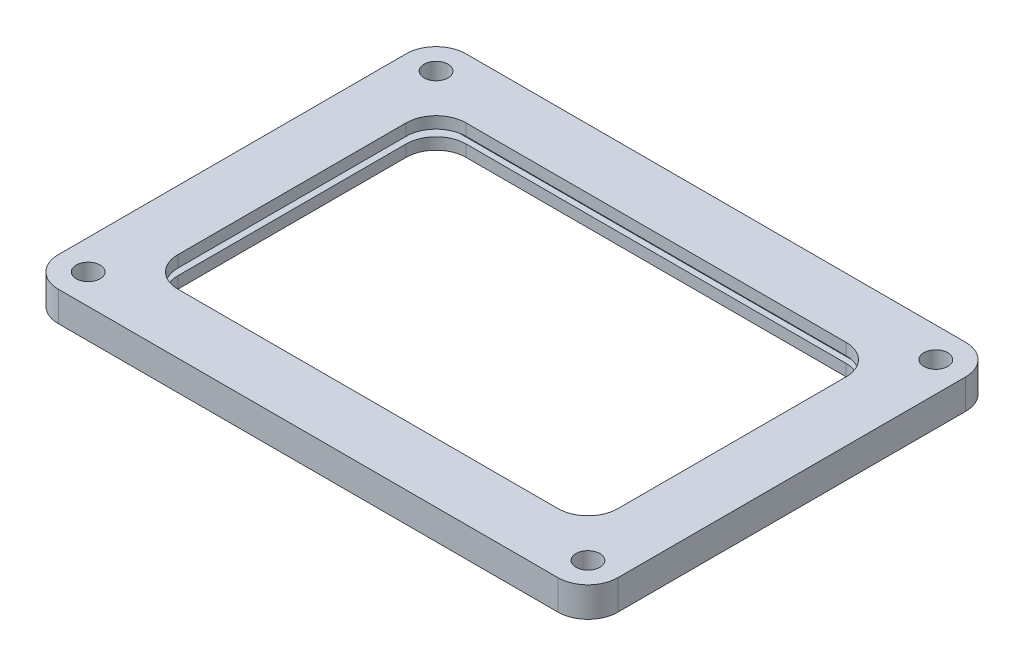
ISO-10303-21;
HEADER;
FILE_DESCRIPTION(('STEP AP214'),'2;1');
FILE_NAME('part.step','',(''),(''),'','','');
FILE_SCHEMA(('AUTOMOTIVE_DESIGN { 1 0 10303 214 1 1 1 1 }'));
ENDSEC;
DATA;
#1=APPLICATION_CONTEXT('core data for automotive mechanical design processes');
#2=APPLICATION_PROTOCOL_DEFINITION('international standard','automotive_design',2000,#1);
#3=PRODUCT_CONTEXT('',#1,'mechanical');
#4=PRODUCT('Part','Part','',(#3));
#5=PRODUCT_RELATED_PRODUCT_CATEGORY('part','',(#4));
#6=PRODUCT_DEFINITION_FORMATION('','',#4);
#7=PRODUCT_DEFINITION_CONTEXT('part definition',#1,'design');
#8=PRODUCT_DEFINITION('design','',#6,#7);
#9=PRODUCT_DEFINITION_SHAPE('','',#8);
#10=(LENGTH_UNIT() NAMED_UNIT(*) SI_UNIT(.MILLI.,.METRE.));
#11=(NAMED_UNIT(*) PLANE_ANGLE_UNIT() SI_UNIT($,.RADIAN.));
#12=(NAMED_UNIT(*) SI_UNIT($,.STERADIAN.) SOLID_ANGLE_UNIT());
#13=UNCERTAINTY_MEASURE_WITH_UNIT(LENGTH_MEASURE(1.E-05),#10,'distance_accuracy_value','');
#14=(GEOMETRIC_REPRESENTATION_CONTEXT(3) GLOBAL_UNCERTAINTY_ASSIGNED_CONTEXT((#13)) GLOBAL_UNIT_ASSIGNED_CONTEXT((#10,
#11,#12)) REPRESENTATION_CONTEXT('',''));
#15=CARTESIAN_POINT('',(0.,0.,0.));
#16=DIRECTION('',(0.,0.,1.));
#17=DIRECTION('',(1.,0.,0.));
#18=AXIS2_PLACEMENT_3D('',#15,#16,#17);
#19=CARTESIAN_POINT('',(-36.79,5.,0.));
#20=DIRECTION('',(-1.,0.,0.));
#21=DIRECTION('',(0.,0.,1.));
#22=AXIS2_PLACEMENT_3D('',#19,#20,#21);
#23=PLANE('',#22);
#24=DIRECTION('',(0.,-1.,0.));
#25=VECTOR('',#24,1.);
#26=CARTESIAN_POINT('',(-36.79,5.,19.09));
#27=LINE('',#26,#25);
#28=CARTESIAN_POINT('',(-36.79,5.,19.09));
#29=VERTEX_POINT('',#28);
#30=CARTESIAN_POINT('',(-36.79,3.05,19.09));
#31=VERTEX_POINT('',#30);
#32=EDGE_CURVE('E428',#29,#31,#27,.T.);
#33=ORIENTED_EDGE('',*,*,#32,.T.);
#34=DIRECTION('',(0.,0.,-1.));
#35=VECTOR('',#34,1.);
#36=CARTESIAN_POINT('',(-36.79,3.05,0.));
#37=LINE('',#36,#35);
#38=CARTESIAN_POINT('',(-36.79,3.05,-19.09));
#39=VERTEX_POINT('',#38);
#40=EDGE_CURVE('E275',#31,#39,#37,.T.);
#41=ORIENTED_EDGE('',*,*,#40,.T.);
#42=DIRECTION('',(0.,-1.,0.));
#43=VECTOR('',#42,1.);
#44=CARTESIAN_POINT('',(-36.79,5.,-19.09));
#45=LINE('',#44,#43);
#46=CARTESIAN_POINT('',(-36.79,5.,-19.09));
#47=VERTEX_POINT('',#46);
#48=EDGE_CURVE('E423',#39,#47,#45,.F.);
#49=ORIENTED_EDGE('',*,*,#48,.T.);
#50=DIRECTION('',(0.,0.,-1.));
#51=VECTOR('',#50,1.);
#52=CARTESIAN_POINT('',(-36.79,5.,0.));
#53=LINE('',#52,#51);
#54=EDGE_CURVE('E316',#29,#47,#53,.T.);
#55=ORIENTED_EDGE('',*,*,#54,.F.);
#56=EDGE_LOOP('',(#33,#41,#49,#55));
#57=FACE_BOUND('',#56,.T.);
#58=ADVANCED_FACE('F35',(#57),#23,.F.);
#59=CARTESIAN_POINT('',(0.,5.,24.09));
#60=DIRECTION('',(0.,0.,-1.));
#61=DIRECTION('',(-1.,0.,0.));
#62=AXIS2_PLACEMENT_3D('',#59,#60,#61);
#63=PLANE('',#62);
#64=DIRECTION('',(1.,0.,0.));
#65=VECTOR('',#64,1.);
#66=CARTESIAN_POINT('',(0.,3.05,24.09));
#67=LINE('',#66,#65);
#68=CARTESIAN_POINT('',(-31.79,3.05,24.09));
#69=VERTEX_POINT('',#68);
#70=CARTESIAN_POINT('',(31.79,3.05,24.09));
#71=VERTEX_POINT('',#70);
#72=EDGE_CURVE('E286',#69,#71,#67,.T.);
#73=ORIENTED_EDGE('',*,*,#72,.F.);
#74=DIRECTION('',(0.,-1.,0.));
#75=VECTOR('',#74,1.);
#76=CARTESIAN_POINT('',(-31.79,5.,24.09));
#77=LINE('',#76,#75);
#78=CARTESIAN_POINT('',(-31.79,5.,24.09));
#79=VERTEX_POINT('',#78);
#80=EDGE_CURVE('E399',#69,#79,#77,.F.);
#81=ORIENTED_EDGE('',*,*,#80,.T.);
#82=DIRECTION('',(1.,0.,0.));
#83=VECTOR('',#82,1.);
#84=CARTESIAN_POINT('',(0.,5.,24.09));
#85=LINE('',#84,#83);
#86=CARTESIAN_POINT('',(31.79,5.,24.09));
#87=VERTEX_POINT('',#86);
#88=EDGE_CURVE('E319',#79,#87,#85,.T.);
#89=ORIENTED_EDGE('',*,*,#88,.T.);
#90=DIRECTION('',(0.,-1.,0.));
#91=VECTOR('',#90,1.);
#92=CARTESIAN_POINT('',(31.79,0.,24.09));
#93=LINE('',#92,#91);
#94=EDGE_CURVE('E404',#87,#71,#93,.T.);
#95=ORIENTED_EDGE('',*,*,#94,.T.);
#96=EDGE_LOOP('',(#73,#81,#89,#95));
#97=FACE_BOUND('',#96,.T.);
#98=ADVANCED_FACE('F496',(#97),#63,.T.);
#99=CARTESIAN_POINT('',(36.79,5.,0.));
#100=DIRECTION('',(-1.,0.,0.));
#101=DIRECTION('',(0.,0.,1.));
#102=AXIS2_PLACEMENT_3D('',#99,#100,#101);
#103=PLANE('',#102);
#104=DIRECTION('',(0.,0.,-1.));
#105=VECTOR('',#104,1.);
#106=CARTESIAN_POINT('',(36.79,3.05,0.));
#107=LINE('',#106,#105);
#108=CARTESIAN_POINT('',(36.79,3.05,19.09));
#109=VERTEX_POINT('',#108);
#110=CARTESIAN_POINT('',(36.79,3.05,-19.09));
#111=VERTEX_POINT('',#110);
#112=EDGE_CURVE('E284',#109,#111,#107,.T.);
#113=ORIENTED_EDGE('',*,*,#112,.F.);
#114=DIRECTION('',(0.,-1.,0.));
#115=VECTOR('',#114,1.);
#116=CARTESIAN_POINT('',(36.79,5.,19.09));
#117=LINE('',#116,#115);
#118=CARTESIAN_POINT('',(36.79,5.,19.09));
#119=VERTEX_POINT('',#118);
#120=EDGE_CURVE('E411',#109,#119,#117,.F.);
#121=ORIENTED_EDGE('',*,*,#120,.T.);
#122=DIRECTION('',(0.,0.,-1.));
#123=VECTOR('',#122,1.);
#124=CARTESIAN_POINT('',(36.79,5.,0.));
#125=LINE('',#124,#123);
#126=CARTESIAN_POINT('',(36.79,5.,-19.09));
#127=VERTEX_POINT('',#126);
#128=EDGE_CURVE('E323',#119,#127,#125,.T.);
#129=ORIENTED_EDGE('',*,*,#128,.T.);
#130=DIRECTION('',(0.,-1.,0.));
#131=VECTOR('',#130,1.);
#132=CARTESIAN_POINT('',(36.79,5.,-19.09));
#133=LINE('',#132,#131);
#134=EDGE_CURVE('E408',#127,#111,#133,.T.);
#135=ORIENTED_EDGE('',*,*,#134,.T.);
#136=EDGE_LOOP('',(#113,#121,#129,#135));
#137=FACE_BOUND('',#136,.T.);
#138=ADVANCED_FACE('F502',(#137),#103,.T.);
#139=CARTESIAN_POINT('',(0.,5.,-24.09));
#140=DIRECTION('',(0.,0.,-1.));
#141=DIRECTION('',(-1.,0.,0.));
#142=AXIS2_PLACEMENT_3D('',#139,#140,#141);
#143=PLANE('',#142);
#144=DIRECTION('',(0.,-1.,0.));
#145=VECTOR('',#144,1.);
#146=CARTESIAN_POINT('',(-31.79,0.,-24.09));
#147=LINE('',#146,#145);
#148=CARTESIAN_POINT('',(-31.79,5.,-24.09));
#149=VERTEX_POINT('',#148);
#150=CARTESIAN_POINT('',(-31.79,3.05,-24.09));
#151=VERTEX_POINT('',#150);
#152=EDGE_CURVE('E416',#149,#151,#147,.T.);
#153=ORIENTED_EDGE('',*,*,#152,.T.);
#154=DIRECTION('',(1.,0.,0.));
#155=VECTOR('',#154,1.);
#156=CARTESIAN_POINT('',(0.,3.05,-24.09));
#157=LINE('',#156,#155);
#158=CARTESIAN_POINT('',(31.79,3.05,-24.09));
#159=VERTEX_POINT('',#158);
#160=EDGE_CURVE('E58',#151,#159,#157,.T.);
#161=ORIENTED_EDGE('',*,*,#160,.T.);
#162=DIRECTION('',(0.,-1.,0.));
#163=VECTOR('',#162,1.);
#164=CARTESIAN_POINT('',(31.79,5.,-24.09));
#165=LINE('',#164,#163);
#166=CARTESIAN_POINT('',(31.79,5.,-24.09));
#167=VERTEX_POINT('',#166);
#168=EDGE_CURVE('E419',#159,#167,#165,.F.);
#169=ORIENTED_EDGE('',*,*,#168,.T.);
#170=DIRECTION('',(1.,0.,0.));
#171=VECTOR('',#170,1.);
#172=CARTESIAN_POINT('',(0.,5.,-24.09));
#173=LINE('',#172,#171);
#174=EDGE_CURVE('E326',#149,#167,#173,.T.);
#175=ORIENTED_EDGE('',*,*,#174,.F.);
#176=EDGE_LOOP('',(#153,#161,#169,#175));
#177=FACE_BOUND('',#176,.T.);
#178=ADVANCED_FACE('F549',(#177),#143,.F.);
#179=CARTESIAN_POINT('',(31.79,5.,19.09));
#180=DIRECTION('',(0.,1.,0.));
#181=DIRECTION('',(0.,0.,1.));
#182=AXIS2_PLACEMENT_3D('',#179,#180,#181);
#183=CYLINDRICAL_SURFACE('',#182,5.);
#184=ORIENTED_EDGE('',*,*,#120,.F.);
#185=CARTESIAN_POINT('',(31.79,3.05,19.09));
#186=DIRECTION('',(0.,1.,0.));
#187=DIRECTION('',(0.,0.,1.));
#188=AXIS2_PLACEMENT_3D('',#185,#186,#187);
#189=CIRCLE('',#188,5.);
#190=EDGE_CURVE('E288',#109,#71,#189,.F.);
#191=ORIENTED_EDGE('',*,*,#190,.T.);
#192=ORIENTED_EDGE('',*,*,#94,.F.);
#193=CARTESIAN_POINT('',(31.79,5.,19.09));
#194=DIRECTION('',(0.,1.,0.));
#195=DIRECTION('',(0.,0.,1.));
#196=AXIS2_PLACEMENT_3D('',#193,#194,#195);
#197=CIRCLE('',#196,5.);
#198=EDGE_CURVE('E433',#119,#87,#197,.F.);
#199=ORIENTED_EDGE('',*,*,#198,.F.);
#200=EDGE_LOOP('',(#184,#191,#192,#199));
#201=FACE_BOUND('',#200,.T.);
#202=ADVANCED_FACE('F545',(#201),#183,.F.);
#203=CARTESIAN_POINT('',(31.79,5.,-19.09));
#204=DIRECTION('',(0.,-1.,0.));
#205=DIRECTION('',(0.,0.,-1.));
#206=AXIS2_PLACEMENT_3D('',#203,#204,#205);
#207=CYLINDRICAL_SURFACE('',#206,5.);
#208=ORIENTED_EDGE('',*,*,#168,.F.);
#209=CARTESIAN_POINT('',(31.79,3.05,-19.09));
#210=DIRECTION('',(0.,1.,0.));
#211=DIRECTION('',(0.,0.,1.));
#212=AXIS2_PLACEMENT_3D('',#209,#210,#211);
#213=CIRCLE('',#212,5.);
#214=EDGE_CURVE('E281',#159,#111,#213,.F.);
#215=ORIENTED_EDGE('',*,*,#214,.T.);
#216=ORIENTED_EDGE('',*,*,#134,.F.);
#217=CARTESIAN_POINT('',(31.79,5.,-19.09));
#218=DIRECTION('',(0.,1.,0.));
#219=DIRECTION('',(0.,0.,1.));
#220=AXIS2_PLACEMENT_3D('',#217,#218,#219);
#221=CIRCLE('',#220,5.);
#222=EDGE_CURVE('E437',#167,#127,#221,.F.);
#223=ORIENTED_EDGE('',*,*,#222,.F.);
#224=EDGE_LOOP('',(#208,#215,#216,#223));
#225=FACE_BOUND('',#224,.T.);
#226=ADVANCED_FACE('F492',(#225),#207,.F.);
#227=CARTESIAN_POINT('',(-31.79,5.,19.09));
#228=DIRECTION('',(0.,-1.,0.));
#229=DIRECTION('',(0.,0.,-1.));
#230=AXIS2_PLACEMENT_3D('',#227,#228,#229);
#231=CYLINDRICAL_SURFACE('',#230,5.);
#232=ORIENTED_EDGE('',*,*,#80,.F.);
#233=CARTESIAN_POINT('',(-31.79,3.05,19.09));
#234=DIRECTION('',(0.,1.,0.));
#235=DIRECTION('',(0.,0.,1.));
#236=AXIS2_PLACEMENT_3D('',#233,#234,#235);
#237=CIRCLE('',#236,5.);
#238=EDGE_CURVE('E278',#69,#31,#237,.F.);
#239=ORIENTED_EDGE('',*,*,#238,.T.);
#240=ORIENTED_EDGE('',*,*,#32,.F.);
#241=CARTESIAN_POINT('',(-31.79,5.,19.09));
#242=DIRECTION('',(0.,1.,0.));
#243=DIRECTION('',(0.,0.,1.));
#244=AXIS2_PLACEMENT_3D('',#241,#242,#243);
#245=CIRCLE('',#244,5.);
#246=EDGE_CURVE('E441',#79,#29,#245,.F.);
#247=ORIENTED_EDGE('',*,*,#246,.F.);
#248=EDGE_LOOP('',(#232,#239,#240,#247));
#249=FACE_BOUND('',#248,.T.);
#250=ADVANCED_FACE('F484',(#249),#231,.F.);
#251=CARTESIAN_POINT('',(-31.79,5.,-19.09));
#252=DIRECTION('',(0.,1.,0.));
#253=DIRECTION('',(0.,0.,1.));
#254=AXIS2_PLACEMENT_3D('',#251,#252,#253);
#255=CYLINDRICAL_SURFACE('',#254,5.);
#256=ORIENTED_EDGE('',*,*,#48,.F.);
#257=CARTESIAN_POINT('',(-31.79,3.05,-19.09));
#258=DIRECTION('',(0.,1.,0.));
#259=DIRECTION('',(0.,0.,1.));
#260=AXIS2_PLACEMENT_3D('',#257,#258,#259);
#261=CIRCLE('',#260,5.);
#262=EDGE_CURVE('E12',#39,#151,#261,.F.);
#263=ORIENTED_EDGE('',*,*,#262,.T.);
#264=ORIENTED_EDGE('',*,*,#152,.F.);
#265=CARTESIAN_POINT('',(-31.79,5.,-19.09));
#266=DIRECTION('',(0.,1.,0.));
#267=DIRECTION('',(0.,0.,1.));
#268=AXIS2_PLACEMENT_3D('',#265,#266,#267);
#269=CIRCLE('',#268,5.);
#270=EDGE_CURVE('E445',#47,#149,#269,.F.);
#271=ORIENTED_EDGE('',*,*,#270,.F.);
#272=EDGE_LOOP('',(#256,#263,#264,#271));
#273=FACE_BOUND('',#272,.T.);
#274=ADVANCED_FACE('F490',(#273),#255,.F.);
#275=CARTESIAN_POINT('',(0.,5.,0.));
#276=DIRECTION('',(0.,1.,0.));
#277=DIRECTION('',(0.,0.,1.));
#278=AXIS2_PLACEMENT_3D('',#275,#276,#277);
#279=PLANE('',#278);
#280=CARTESIAN_POINT('',(41.79,5.,29.09));
#281=DIRECTION('',(0.,1.,0.));
#282=DIRECTION('',(0.,0.,1.));
#283=AXIS2_PLACEMENT_3D('',#280,#281,#282);
#284=CIRCLE('',#283,2.);
#285=CARTESIAN_POINT('',(41.79,5.,31.09));
#286=VERTEX_POINT('',#285);
#287=EDGE_CURVE('E296',#286,#286,#284,.T.);
#288=ORIENTED_EDGE('',*,*,#287,.F.);
#289=EDGE_LOOP('',(#288));
#290=FACE_BOUND('',#289,.T.);
#291=CARTESIAN_POINT('',(41.79,5.,-29.09));
#292=DIRECTION('',(0.,-1.,0.));
#293=DIRECTION('',(0.,0.,-1.));
#294=AXIS2_PLACEMENT_3D('',#291,#292,#293);
#295=CIRCLE('',#294,2.);
#296=CARTESIAN_POINT('',(41.79,5.,-31.09));
#297=VERTEX_POINT('',#296);
#298=EDGE_CURVE('E310',#297,#297,#295,.T.);
#299=ORIENTED_EDGE('',*,*,#298,.T.);
#300=EDGE_LOOP('',(#299));
#301=FACE_BOUND('',#300,.T.);
#302=ORIENTED_EDGE('',*,*,#88,.F.);
#303=ORIENTED_EDGE('',*,*,#246,.T.);
#304=ORIENTED_EDGE('',*,*,#54,.T.);
#305=ORIENTED_EDGE('',*,*,#270,.T.);
#306=ORIENTED_EDGE('',*,*,#174,.T.);
#307=ORIENTED_EDGE('',*,*,#222,.T.);
#308=ORIENTED_EDGE('',*,*,#128,.F.);
#309=ORIENTED_EDGE('',*,*,#198,.T.);
#310=EDGE_LOOP('',(#302,#303,#304,#305,#306,#307,#308,#309));
#311=FACE_BOUND('',#310,.T.);
#312=DIRECTION('',(1.,0.,0.));
#313=VECTOR('',#312,1.);
#314=CARTESIAN_POINT('',(-46.79,5.,-34.09));
#315=LINE('',#314,#313);
#316=CARTESIAN_POINT('',(-41.79,5.,-34.09));
#317=VERTEX_POINT('',#316);
#318=CARTESIAN_POINT('',(41.79,5.,-34.09));
#319=VERTEX_POINT('',#318);
#320=EDGE_CURVE('E347',#317,#319,#315,.T.);
#321=ORIENTED_EDGE('',*,*,#320,.F.);
#322=CARTESIAN_POINT('',(-41.79,5.,-29.09));
#323=DIRECTION('',(0.,1.,0.));
#324=DIRECTION('',(0.,0.,1.));
#325=AXIS2_PLACEMENT_3D('',#322,#323,#324);
#326=CIRCLE('',#325,5.);
#327=CARTESIAN_POINT('',(-46.79,5.,-29.09));
#328=VERTEX_POINT('',#327);
#329=EDGE_CURVE('E387',#317,#328,#326,.T.);
#330=ORIENTED_EDGE('',*,*,#329,.T.);
#331=DIRECTION('',(0.,0.,-1.));
#332=VECTOR('',#331,1.);
#333=CARTESIAN_POINT('',(-46.79,5.,34.09));
#334=LINE('',#333,#332);
#335=CARTESIAN_POINT('',(-46.79,5.,29.09));
#336=VERTEX_POINT('',#335);
#337=EDGE_CURVE('E350',#336,#328,#334,.T.);
#338=ORIENTED_EDGE('',*,*,#337,.F.);
#339=CARTESIAN_POINT('',(-41.79,5.,29.09));
#340=DIRECTION('',(0.,1.,0.));
#341=DIRECTION('',(0.,0.,1.));
#342=AXIS2_PLACEMENT_3D('',#339,#340,#341);
#343=CIRCLE('',#342,5.);
#344=CARTESIAN_POINT('',(-41.79,5.,34.09));
#345=VERTEX_POINT('',#344);
#346=EDGE_CURVE('E385',#336,#345,#343,.T.);
#347=ORIENTED_EDGE('',*,*,#346,.T.);
#348=DIRECTION('',(1.,0.,0.));
#349=VECTOR('',#348,1.);
#350=CARTESIAN_POINT('',(-46.79,5.,34.09));
#351=LINE('',#350,#349);
#352=CARTESIAN_POINT('',(41.79,5.,34.09));
#353=VERTEX_POINT('',#352);
#354=EDGE_CURVE('E340',#345,#353,#351,.T.);
#355=ORIENTED_EDGE('',*,*,#354,.T.);
#356=CARTESIAN_POINT('',(41.79,5.,29.09));
#357=DIRECTION('',(0.,1.,0.));
#358=DIRECTION('',(0.,0.,1.));
#359=AXIS2_PLACEMENT_3D('',#356,#357,#358);
#360=CIRCLE('',#359,5.);
#361=CARTESIAN_POINT('',(46.79,5.,29.09));
#362=VERTEX_POINT('',#361);
#363=EDGE_CURVE('E381',#353,#362,#360,.T.);
#364=ORIENTED_EDGE('',*,*,#363,.T.);
#365=DIRECTION('',(0.,0.,-1.));
#366=VECTOR('',#365,1.);
#367=CARTESIAN_POINT('',(46.79,5.,34.09));
#368=LINE('',#367,#366);
#369=CARTESIAN_POINT('',(46.79,5.,-29.09));
#370=VERTEX_POINT('',#369);
#371=EDGE_CURVE('E343',#362,#370,#368,.T.);
#372=ORIENTED_EDGE('',*,*,#371,.T.);
#373=CARTESIAN_POINT('',(41.79,5.,-29.09));
#374=DIRECTION('',(0.,1.,0.));
#375=DIRECTION('',(0.,0.,1.));
#376=AXIS2_PLACEMENT_3D('',#373,#374,#375);
#377=CIRCLE('',#376,5.);
#378=EDGE_CURVE('E383',#370,#319,#377,.T.);
#379=ORIENTED_EDGE('',*,*,#378,.T.);
#380=EDGE_LOOP('',(#321,#330,#338,#347,#355,#364,#372,#379));
#381=FACE_BOUND('',#380,.T.);
#382=CARTESIAN_POINT('',(-41.79,5.,29.09));
#383=DIRECTION('',(0.,-1.,0.));
#384=DIRECTION('',(0.,0.,-1.));
#385=AXIS2_PLACEMENT_3D('',#382,#383,#384);
#386=CIRCLE('',#385,2.);
#387=CARTESIAN_POINT('',(-41.79,5.,27.09));
#388=VERTEX_POINT('',#387);
#389=EDGE_CURVE('E302',#388,#388,#386,.T.);
#390=ORIENTED_EDGE('',*,*,#389,.T.);
#391=EDGE_LOOP('',(#390));
#392=FACE_BOUND('',#391,.T.);
#393=CARTESIAN_POINT('',(-41.79,5.,-29.09));
#394=DIRECTION('',(0.,1.,0.));
#395=DIRECTION('',(0.,0.,1.));
#396=AXIS2_PLACEMENT_3D('',#393,#394,#395);
#397=CIRCLE('',#396,2.);
#398=CARTESIAN_POINT('',(-41.79,5.,-27.09));
#399=VERTEX_POINT('',#398);
#400=EDGE_CURVE('E291',#399,#399,#397,.T.);
#401=ORIENTED_EDGE('',*,*,#400,.F.);
#402=EDGE_LOOP('',(#401));
#403=FACE_BOUND('',#402,.T.);
#404=ADVANCED_FACE('F567',(#290,#301,#311,#381,#392,#403),#279,.T.);
#405=CARTESIAN_POINT('',(0.,0.,0.));
#406=DIRECTION('',(0.,1.,0.));
#407=DIRECTION('',(0.,0.,1.));
#408=AXIS2_PLACEMENT_3D('',#405,#406,#407);
#409=PLANE('',#408);
#410=CARTESIAN_POINT('',(-41.79,0.,29.09));
#411=DIRECTION('',(0.,-1.,0.));
#412=DIRECTION('',(0.,0.,-1.));
#413=AXIS2_PLACEMENT_3D('',#410,#411,#412);
#414=CIRCLE('',#413,2.);
#415=CARTESIAN_POINT('',(-41.79,0.,27.09));
#416=VERTEX_POINT('',#415);
#417=EDGE_CURVE('E299',#416,#416,#414,.T.);
#418=ORIENTED_EDGE('',*,*,#417,.F.);
#419=EDGE_LOOP('',(#418));
#420=FACE_BOUND('',#419,.T.);
#421=CARTESIAN_POINT('',(41.79,0.,-29.09));
#422=DIRECTION('',(0.,-1.,0.));
#423=DIRECTION('',(0.,0.,-1.));
#424=AXIS2_PLACEMENT_3D('',#421,#422,#423);
#425=CIRCLE('',#424,2.);
#426=CARTESIAN_POINT('',(41.79,0.,-31.09));
#427=VERTEX_POINT('',#426);
#428=EDGE_CURVE('E295',#427,#427,#425,.T.);
#429=ORIENTED_EDGE('',*,*,#428,.F.);
#430=EDGE_LOOP('',(#429));
#431=FACE_BOUND('',#430,.T.);
#432=DIRECTION('',(1.,0.,0.));
#433=VECTOR('',#432,1.);
#434=CARTESIAN_POINT('',(0.,0.,-24.09));
#435=LINE('',#434,#433);
#436=CARTESIAN_POINT('',(-31.79,0.,-24.09));
#437=VERTEX_POINT('',#436);
#438=CARTESIAN_POINT('',(31.79,0.,-24.09));
#439=VERTEX_POINT('',#438);
#440=EDGE_CURVE('E320',#437,#439,#435,.T.);
#441=ORIENTED_EDGE('',*,*,#440,.F.);
#442=CARTESIAN_POINT('',(-31.79,0.,-19.09));
#443=DIRECTION('',(0.,1.,0.));
#444=DIRECTION('',(0.,0.,1.));
#445=AXIS2_PLACEMENT_3D('',#442,#443,#444);
#446=CIRCLE('',#445,5.);
#447=CARTESIAN_POINT('',(-36.79,0.,-19.09));
#448=VERTEX_POINT('',#447);
#449=EDGE_CURVE('E443',#437,#448,#446,.T.);
#450=ORIENTED_EDGE('',*,*,#449,.T.);
#451=DIRECTION('',(0.,0.,-1.));
#452=VECTOR('',#451,1.);
#453=CARTESIAN_POINT('',(-36.79,0.,0.));
#454=LINE('',#453,#452);
#455=CARTESIAN_POINT('',(-36.79,0.,19.09));
#456=VERTEX_POINT('',#455);
#457=EDGE_CURVE('E313',#456,#448,#454,.T.);
#458=ORIENTED_EDGE('',*,*,#457,.F.);
#459=CARTESIAN_POINT('',(-31.79,0.,19.09));
#460=DIRECTION('',(0.,1.,0.));
#461=DIRECTION('',(0.,0.,1.));
#462=AXIS2_PLACEMENT_3D('',#459,#460,#461);
#463=CIRCLE('',#462,5.);
#464=CARTESIAN_POINT('',(-31.79,0.,24.09));
#465=VERTEX_POINT('',#464);
#466=EDGE_CURVE('E439',#456,#465,#463,.T.);
#467=ORIENTED_EDGE('',*,*,#466,.T.);
#468=DIRECTION('',(1.,0.,0.));
#469=VECTOR('',#468,1.);
#470=CARTESIAN_POINT('',(0.,0.,24.09));
#471=LINE('',#470,#469);
#472=CARTESIAN_POINT('',(31.79,0.,24.09));
#473=VERTEX_POINT('',#472);
#474=EDGE_CURVE('E332',#465,#473,#471,.T.);
#475=ORIENTED_EDGE('',*,*,#474,.T.);
#476=CARTESIAN_POINT('',(31.79,0.,19.09));
#477=DIRECTION('',(0.,1.,0.));
#478=DIRECTION('',(0.,0.,1.));
#479=AXIS2_PLACEMENT_3D('',#476,#477,#478);
#480=CIRCLE('',#479,5.);
#481=CARTESIAN_POINT('',(36.79,0.,19.09));
#482=VERTEX_POINT('',#481);
#483=EDGE_CURVE('E431',#473,#482,#480,.T.);
#484=ORIENTED_EDGE('',*,*,#483,.T.);
#485=DIRECTION('',(0.,0.,-1.));
#486=VECTOR('',#485,1.);
#487=CARTESIAN_POINT('',(36.79,0.,0.));
#488=LINE('',#487,#486);
#489=CARTESIAN_POINT('',(36.79,0.,-19.09));
#490=VERTEX_POINT('',#489);
#491=EDGE_CURVE('E335',#482,#490,#488,.T.);
#492=ORIENTED_EDGE('',*,*,#491,.T.);
#493=CARTESIAN_POINT('',(31.79,0.,-19.09));
#494=DIRECTION('',(0.,1.,0.));
#495=DIRECTION('',(0.,0.,1.));
#496=AXIS2_PLACEMENT_3D('',#493,#494,#495);
#497=CIRCLE('',#496,5.);
#498=EDGE_CURVE('E435',#490,#439,#497,.T.);
#499=ORIENTED_EDGE('',*,*,#498,.T.);
#500=EDGE_LOOP('',(#441,#450,#458,#467,#475,#484,#492,#499));
#501=FACE_BOUND('',#500,.T.);
#502=DIRECTION('',(0.,0.,-1.));
#503=VECTOR('',#502,1.);
#504=CARTESIAN_POINT('',(-46.79,0.,34.09));
#505=LINE('',#504,#503);
#506=CARTESIAN_POINT('',(-46.79,0.,29.09));
#507=VERTEX_POINT('',#506);
#508=CARTESIAN_POINT('',(-46.79,0.,-29.09));
#509=VERTEX_POINT('',#508);
#510=EDGE_CURVE('E344',#507,#509,#505,.T.);
#511=ORIENTED_EDGE('',*,*,#510,.T.);
#512=CARTESIAN_POINT('',(-41.79,0.,-29.09));
#513=DIRECTION('',(0.,1.,0.));
#514=DIRECTION('',(0.,0.,1.));
#515=AXIS2_PLACEMENT_3D('',#512,#513,#514);
#516=CIRCLE('',#515,5.);
#517=CARTESIAN_POINT('',(-41.79,0.,-34.09));
#518=VERTEX_POINT('',#517);
#519=EDGE_CURVE('E374',#509,#518,#516,.F.);
#520=ORIENTED_EDGE('',*,*,#519,.T.);
#521=DIRECTION('',(1.,0.,0.));
#522=VECTOR('',#521,1.);
#523=CARTESIAN_POINT('',(-46.79,0.,-34.09));
#524=LINE('',#523,#522);
#525=CARTESIAN_POINT('',(41.79,0.,-34.09));
#526=VERTEX_POINT('',#525);
#527=EDGE_CURVE('E359',#518,#526,#524,.T.);
#528=ORIENTED_EDGE('',*,*,#527,.T.);
#529=CARTESIAN_POINT('',(41.79,0.,-29.09));
#530=DIRECTION('',(0.,1.,0.));
#531=DIRECTION('',(0.,0.,1.));
#532=AXIS2_PLACEMENT_3D('',#529,#530,#531);
#533=CIRCLE('',#532,5.);
#534=CARTESIAN_POINT('',(46.79,0.,-29.09));
#535=VERTEX_POINT('',#534);
#536=EDGE_CURVE('E370',#526,#535,#533,.F.);
#537=ORIENTED_EDGE('',*,*,#536,.T.);
#538=DIRECTION('',(0.,0.,-1.));
#539=VECTOR('',#538,1.);
#540=CARTESIAN_POINT('',(46.79,0.,34.09));
#541=LINE('',#540,#539);
#542=CARTESIAN_POINT('',(46.79,0.,29.09));
#543=VERTEX_POINT('',#542);
#544=EDGE_CURVE('E356',#543,#535,#541,.T.);
#545=ORIENTED_EDGE('',*,*,#544,.F.);
#546=CARTESIAN_POINT('',(41.79,0.,29.09));
#547=DIRECTION('',(0.,1.,0.));
#548=DIRECTION('',(0.,0.,1.));
#549=AXIS2_PLACEMENT_3D('',#546,#547,#548);
#550=CIRCLE('',#549,5.);
#551=CARTESIAN_POINT('',(41.79,0.,34.09));
#552=VERTEX_POINT('',#551);
#553=EDGE_CURVE('E368',#543,#552,#550,.F.);
#554=ORIENTED_EDGE('',*,*,#553,.T.);
#555=DIRECTION('',(1.,0.,0.));
#556=VECTOR('',#555,1.);
#557=CARTESIAN_POINT('',(-46.79,0.,34.09));
#558=LINE('',#557,#556);
#559=CARTESIAN_POINT('',(-41.79,0.,34.09));
#560=VERTEX_POINT('',#559);
#561=EDGE_CURVE('E329',#560,#552,#558,.T.);
#562=ORIENTED_EDGE('',*,*,#561,.F.);
#563=CARTESIAN_POINT('',(-41.79,0.,29.09));
#564=DIRECTION('',(0.,1.,0.));
#565=DIRECTION('',(0.,0.,1.));
#566=AXIS2_PLACEMENT_3D('',#563,#564,#565);
#567=CIRCLE('',#566,5.);
#568=EDGE_CURVE('E372',#560,#507,#567,.F.);
#569=ORIENTED_EDGE('',*,*,#568,.T.);
#570=EDGE_LOOP('',(#511,#520,#528,#537,#545,#554,#562,#569));
#571=FACE_BOUND('',#570,.T.);
#572=CARTESIAN_POINT('',(41.79,0.,29.09));
#573=DIRECTION('',(0.,1.,0.));
#574=DIRECTION('',(0.,0.,1.));
#575=AXIS2_PLACEMENT_3D('',#572,#573,#574);
#576=CIRCLE('',#575,2.);
#577=CARTESIAN_POINT('',(41.79,0.,31.09));
#578=VERTEX_POINT('',#577);
#579=EDGE_CURVE('E292',#578,#578,#576,.T.);
#580=ORIENTED_EDGE('',*,*,#579,.T.);
#581=EDGE_LOOP('',(#580));
#582=FACE_BOUND('',#581,.T.);
#583=CARTESIAN_POINT('',(-41.79,0.,-29.09));
#584=DIRECTION('',(0.,1.,0.));
#585=DIRECTION('',(0.,0.,1.));
#586=AXIS2_PLACEMENT_3D('',#583,#584,#585);
#587=CIRCLE('',#586,2.);
#588=CARTESIAN_POINT('',(-41.79,0.,-27.09));
#589=VERTEX_POINT('',#588);
#590=EDGE_CURVE('E305',#589,#589,#587,.T.);
#591=ORIENTED_EDGE('',*,*,#590,.T.);
#592=EDGE_LOOP('',(#591));
#593=FACE_BOUND('',#592,.T.);
#594=ADVANCED_FACE('F458',(#420,#431,#501,#571,#582,#593),#409,.F.);
#595=CARTESIAN_POINT('',(-46.79,5.,34.09));
#596=DIRECTION('',(0.,0.,-1.));
#597=DIRECTION('',(-1.,0.,0.));
#598=AXIS2_PLACEMENT_3D('',#595,#596,#597);
#599=PLANE('',#598);
#600=ORIENTED_EDGE('',*,*,#354,.F.);
#601=DIRECTION('',(0.,-1.,0.));
#602=VECTOR('',#601,1.);
#603=CARTESIAN_POINT('',(-41.79,0.,34.09));
#604=LINE('',#603,#602);
#605=EDGE_CURVE('E391',#345,#560,#604,.T.);
#606=ORIENTED_EDGE('',*,*,#605,.T.);
#607=ORIENTED_EDGE('',*,*,#561,.T.);
#608=DIRECTION('',(0.,-1.,0.));
#609=VECTOR('',#608,1.);
#610=CARTESIAN_POINT('',(41.79,5.,34.09));
#611=LINE('',#610,#609);
#612=EDGE_CURVE('E389',#552,#353,#611,.F.);
#613=ORIENTED_EDGE('',*,*,#612,.T.);
#614=EDGE_LOOP('',(#600,#606,#607,#613));
#615=FACE_BOUND('',#614,.T.);
#616=ADVANCED_FACE('F523',(#615),#599,.F.);
#617=CARTESIAN_POINT('',(46.79,5.,34.09));
#618=DIRECTION('',(-1.,0.,0.));
#619=DIRECTION('',(0.,0.,1.));
#620=AXIS2_PLACEMENT_3D('',#617,#618,#619);
#621=PLANE('',#620);
#622=ORIENTED_EDGE('',*,*,#544,.T.);
#623=DIRECTION('',(0.,-1.,0.));
#624=VECTOR('',#623,1.);
#625=CARTESIAN_POINT('',(46.79,5.,-29.09));
#626=LINE('',#625,#624);
#627=EDGE_CURVE('E397',#535,#370,#626,.F.);
#628=ORIENTED_EDGE('',*,*,#627,.T.);
#629=ORIENTED_EDGE('',*,*,#371,.F.);
#630=DIRECTION('',(0.,-1.,0.));
#631=VECTOR('',#630,1.);
#632=CARTESIAN_POINT('',(46.79,5.,29.09));
#633=LINE('',#632,#631);
#634=EDGE_CURVE('E394',#362,#543,#633,.T.);
#635=ORIENTED_EDGE('',*,*,#634,.T.);
#636=EDGE_LOOP('',(#622,#628,#629,#635));
#637=FACE_BOUND('',#636,.T.);
#638=ADVANCED_FACE('F516',(#637),#621,.F.);
#639=CARTESIAN_POINT('',(-46.79,5.,-34.09));
#640=DIRECTION('',(0.,0.,-1.));
#641=DIRECTION('',(-1.,0.,0.));
#642=AXIS2_PLACEMENT_3D('',#639,#640,#641);
#643=PLANE('',#642);
#644=ORIENTED_EDGE('',*,*,#527,.F.);
#645=DIRECTION('',(0.,-1.,0.));
#646=VECTOR('',#645,1.);
#647=CARTESIAN_POINT('',(-41.79,5.,-34.09));
#648=LINE('',#647,#646);
#649=EDGE_CURVE('E379',#518,#317,#648,.F.);
#650=ORIENTED_EDGE('',*,*,#649,.T.);
#651=ORIENTED_EDGE('',*,*,#320,.T.);
#652=DIRECTION('',(0.,-1.,0.));
#653=VECTOR('',#652,1.);
#654=CARTESIAN_POINT('',(41.79,0.,-34.09));
#655=LINE('',#654,#653);
#656=EDGE_CURVE('E376',#319,#526,#655,.T.);
#657=ORIENTED_EDGE('',*,*,#656,.T.);
#658=EDGE_LOOP('',(#644,#650,#651,#657));
#659=FACE_BOUND('',#658,.T.);
#660=ADVANCED_FACE('F511',(#659),#643,.T.);
#661=CARTESIAN_POINT('',(-46.79,5.,34.09));
#662=DIRECTION('',(-1.,0.,0.));
#663=DIRECTION('',(0.,0.,1.));
#664=AXIS2_PLACEMENT_3D('',#661,#662,#663);
#665=PLANE('',#664);
#666=DIRECTION('',(0.,-1.,0.));
#667=VECTOR('',#666,1.);
#668=CARTESIAN_POINT('',(-46.79,3.05,-25.09));
#669=LINE('',#668,#667);
#670=CARTESIAN_POINT('',(-46.79,3.05,-25.09));
#671=VERTEX_POINT('',#670);
#672=CARTESIAN_POINT('',(-46.79,1.95,-25.09));
#673=VERTEX_POINT('',#672);
#674=EDGE_CURVE('E50',#671,#673,#669,.T.);
#675=ORIENTED_EDGE('',*,*,#674,.F.);
#676=DIRECTION('',(0.,0.,-1.));
#677=VECTOR('',#676,1.);
#678=CARTESIAN_POINT('',(-46.79,3.05,-25.09));
#679=LINE('',#678,#677);
#680=CARTESIAN_POINT('',(-46.79,3.05,25.09));
#681=VERTEX_POINT('',#680);
#682=EDGE_CURVE('E243',#681,#671,#679,.T.);
#683=ORIENTED_EDGE('',*,*,#682,.F.);
#684=DIRECTION('',(0.,1.,0.));
#685=VECTOR('',#684,1.);
#686=CARTESIAN_POINT('',(-46.79,3.05,25.09));
#687=LINE('',#686,#685);
#688=CARTESIAN_POINT('',(-46.79,1.95,25.09));
#689=VERTEX_POINT('',#688);
#690=EDGE_CURVE('E225',#689,#681,#687,.T.);
#691=ORIENTED_EDGE('',*,*,#690,.F.);
#692=DIRECTION('',(0.,0.,1.));
#693=VECTOR('',#692,1.);
#694=CARTESIAN_POINT('',(-46.79,1.95,-25.09));
#695=LINE('',#694,#693);
#696=EDGE_CURVE('E235',#673,#689,#695,.T.);
#697=ORIENTED_EDGE('',*,*,#696,.F.);
#698=EDGE_LOOP('',(#675,#683,#691,#697));
#699=FACE_BOUND('',#698,.T.);
#700=ORIENTED_EDGE('',*,*,#337,.T.);
#701=DIRECTION('',(0.,-1.,0.));
#702=VECTOR('',#701,1.);
#703=CARTESIAN_POINT('',(-46.79,5.,-29.09));
#704=LINE('',#703,#702);
#705=EDGE_CURVE('E365',#328,#509,#704,.T.);
#706=ORIENTED_EDGE('',*,*,#705,.T.);
#707=ORIENTED_EDGE('',*,*,#510,.F.);
#708=DIRECTION('',(0.,-1.,0.));
#709=VECTOR('',#708,1.);
#710=CARTESIAN_POINT('',(-46.79,5.,29.09));
#711=LINE('',#710,#709);
#712=EDGE_CURVE('E353',#507,#336,#711,.F.);
#713=ORIENTED_EDGE('',*,*,#712,.T.);
#714=EDGE_LOOP('',(#700,#706,#707,#713));
#715=FACE_BOUND('',#714,.T.);
#716=ADVANCED_FACE('F240',(#699,#715),#665,.T.);
#717=CARTESIAN_POINT('',(-36.79,1.95,-19.09));
#718=VERTEX_POINT('',#717);
#719=EDGE_CURVE('E424',#448,#718,#45,.F.);
#720=ORIENTED_EDGE('',*,*,#719,.T.);
#721=DIRECTION('',(0.,0.,1.));
#722=VECTOR('',#721,1.);
#723=CARTESIAN_POINT('',(-36.79,1.95,0.));
#724=LINE('',#723,#722);
#725=CARTESIAN_POINT('',(-36.79,1.95,19.09));
#726=VERTEX_POINT('',#725);
#727=EDGE_CURVE('E258',#718,#726,#724,.T.);
#728=ORIENTED_EDGE('',*,*,#727,.T.);
#729=EDGE_CURVE('E427',#726,#456,#27,.T.);
#730=ORIENTED_EDGE('',*,*,#729,.T.);
#731=ORIENTED_EDGE('',*,*,#457,.T.);
#732=EDGE_LOOP('',(#720,#728,#730,#731));
#733=FACE_BOUND('',#732,.T.);
#734=ADVANCED_FACE('F452',(#733),#23,.F.);
#735=DIRECTION('',(-1.,0.,0.));
#736=VECTOR('',#735,1.);
#737=CARTESIAN_POINT('',(0.,1.95,24.09));
#738=LINE('',#737,#736);
#739=CARTESIAN_POINT('',(31.79,1.95,24.09));
#740=VERTEX_POINT('',#739);
#741=CARTESIAN_POINT('',(-31.79,1.95,24.09));
#742=VERTEX_POINT('',#741);
#743=EDGE_CURVE('E269',#740,#742,#738,.T.);
#744=ORIENTED_EDGE('',*,*,#743,.F.);
#745=EDGE_CURVE('E403',#740,#473,#93,.T.);
#746=ORIENTED_EDGE('',*,*,#745,.T.);
#747=ORIENTED_EDGE('',*,*,#474,.F.);
#748=EDGE_CURVE('E400',#465,#742,#77,.F.);
#749=ORIENTED_EDGE('',*,*,#748,.T.);
#750=EDGE_LOOP('',(#744,#746,#747,#749));
#751=FACE_BOUND('',#750,.T.);
#752=ADVANCED_FACE('F479',(#751),#63,.T.);
#753=DIRECTION('',(0.,0.,1.));
#754=VECTOR('',#753,1.);
#755=CARTESIAN_POINT('',(36.79,1.95,0.));
#756=LINE('',#755,#754);
#757=CARTESIAN_POINT('',(36.79,1.95,-19.09));
#758=VERTEX_POINT('',#757);
#759=CARTESIAN_POINT('',(36.79,1.95,19.09));
#760=VERTEX_POINT('',#759);
#761=EDGE_CURVE('E267',#758,#760,#756,.T.);
#762=ORIENTED_EDGE('',*,*,#761,.F.);
#763=EDGE_CURVE('E407',#758,#490,#133,.T.);
#764=ORIENTED_EDGE('',*,*,#763,.T.);
#765=ORIENTED_EDGE('',*,*,#491,.F.);
#766=EDGE_CURVE('E412',#482,#760,#117,.F.);
#767=ORIENTED_EDGE('',*,*,#766,.T.);
#768=EDGE_LOOP('',(#762,#764,#765,#767));
#769=FACE_BOUND('',#768,.T.);
#770=ADVANCED_FACE('F470',(#769),#103,.T.);
#771=CARTESIAN_POINT('',(31.79,1.95,-24.09));
#772=VERTEX_POINT('',#771);
#773=EDGE_CURVE('E420',#439,#772,#165,.F.);
#774=ORIENTED_EDGE('',*,*,#773,.T.);
#775=DIRECTION('',(-1.,0.,0.));
#776=VECTOR('',#775,1.);
#777=CARTESIAN_POINT('',(0.,1.95,-24.09));
#778=LINE('',#777,#776);
#779=CARTESIAN_POINT('',(-31.79,1.95,-24.09));
#780=VERTEX_POINT('',#779);
#781=EDGE_CURVE('E254',#772,#780,#778,.T.);
#782=ORIENTED_EDGE('',*,*,#781,.T.);
#783=EDGE_CURVE('E415',#780,#437,#147,.T.);
#784=ORIENTED_EDGE('',*,*,#783,.T.);
#785=ORIENTED_EDGE('',*,*,#440,.T.);
#786=EDGE_LOOP('',(#774,#782,#784,#785));
#787=FACE_BOUND('',#786,.T.);
#788=ADVANCED_FACE('F464',(#787),#143,.F.);
#789=CARTESIAN_POINT('',(-41.79,5.,-29.09));
#790=DIRECTION('',(0.,-1.,0.));
#791=DIRECTION('',(0.,0.,-1.));
#792=AXIS2_PLACEMENT_3D('',#789,#790,#791);
#793=CYLINDRICAL_SURFACE('',#792,5.);
#794=ORIENTED_EDGE('',*,*,#329,.F.);
#795=ORIENTED_EDGE('',*,*,#649,.F.);
#796=ORIENTED_EDGE('',*,*,#519,.F.);
#797=ORIENTED_EDGE('',*,*,#705,.F.);
#798=EDGE_LOOP('',(#794,#795,#796,#797));
#799=FACE_BOUND('',#798,.T.);
#800=ADVANCED_FACE('F528',(#799),#793,.T.);
#801=CARTESIAN_POINT('',(-41.79,5.,29.09));
#802=DIRECTION('',(0.,1.,0.));
#803=DIRECTION('',(0.,0.,1.));
#804=AXIS2_PLACEMENT_3D('',#801,#802,#803);
#805=CYLINDRICAL_SURFACE('',#804,5.);
#806=ORIENTED_EDGE('',*,*,#346,.F.);
#807=ORIENTED_EDGE('',*,*,#712,.F.);
#808=ORIENTED_EDGE('',*,*,#568,.F.);
#809=ORIENTED_EDGE('',*,*,#605,.F.);
#810=EDGE_LOOP('',(#806,#807,#808,#809));
#811=FACE_BOUND('',#810,.T.);
#812=ADVANCED_FACE('F531',(#811),#805,.T.);
#813=CARTESIAN_POINT('',(41.79,5.,-29.09));
#814=DIRECTION('',(0.,1.,0.));
#815=DIRECTION('',(0.,0.,1.));
#816=AXIS2_PLACEMENT_3D('',#813,#814,#815);
#817=CYLINDRICAL_SURFACE('',#816,5.);
#818=ORIENTED_EDGE('',*,*,#378,.F.);
#819=ORIENTED_EDGE('',*,*,#627,.F.);
#820=ORIENTED_EDGE('',*,*,#536,.F.);
#821=ORIENTED_EDGE('',*,*,#656,.F.);
#822=EDGE_LOOP('',(#818,#819,#820,#821));
#823=FACE_BOUND('',#822,.T.);
#824=ADVANCED_FACE('F535',(#823),#817,.T.);
#825=CARTESIAN_POINT('',(41.79,5.,29.09));
#826=DIRECTION('',(0.,-1.,0.));
#827=DIRECTION('',(0.,0.,-1.));
#828=AXIS2_PLACEMENT_3D('',#825,#826,#827);
#829=CYLINDRICAL_SURFACE('',#828,5.);
#830=ORIENTED_EDGE('',*,*,#363,.F.);
#831=ORIENTED_EDGE('',*,*,#612,.F.);
#832=ORIENTED_EDGE('',*,*,#553,.F.);
#833=ORIENTED_EDGE('',*,*,#634,.F.);
#834=EDGE_LOOP('',(#830,#831,#832,#833));
#835=FACE_BOUND('',#834,.T.);
#836=ADVANCED_FACE('F539',(#835),#829,.T.);
#837=ORIENTED_EDGE('',*,*,#745,.F.);
#838=CARTESIAN_POINT('',(31.79,1.95,19.09));
#839=DIRECTION('',(0.,-1.,0.));
#840=DIRECTION('',(0.,0.,-1.));
#841=AXIS2_PLACEMENT_3D('',#838,#839,#840);
#842=CIRCLE('',#841,5.);
#843=EDGE_CURVE('E271',#740,#760,#842,.F.);
#844=ORIENTED_EDGE('',*,*,#843,.T.);
#845=ORIENTED_EDGE('',*,*,#766,.F.);
#846=ORIENTED_EDGE('',*,*,#483,.F.);
#847=EDGE_LOOP('',(#837,#844,#845,#846));
#848=FACE_BOUND('',#847,.T.);
#849=ADVANCED_FACE('F476',(#848),#183,.F.);
#850=ORIENTED_EDGE('',*,*,#763,.F.);
#851=CARTESIAN_POINT('',(31.79,1.95,-19.09));
#852=DIRECTION('',(0.,-1.,0.));
#853=DIRECTION('',(0.,0.,-1.));
#854=AXIS2_PLACEMENT_3D('',#851,#852,#853);
#855=CIRCLE('',#854,5.);
#856=EDGE_CURVE('E264',#758,#772,#855,.F.);
#857=ORIENTED_EDGE('',*,*,#856,.T.);
#858=ORIENTED_EDGE('',*,*,#773,.F.);
#859=ORIENTED_EDGE('',*,*,#498,.F.);
#860=EDGE_LOOP('',(#850,#857,#858,#859));
#861=FACE_BOUND('',#860,.T.);
#862=ADVANCED_FACE('F467',(#861),#207,.F.);
#863=ORIENTED_EDGE('',*,*,#729,.F.);
#864=CARTESIAN_POINT('',(-31.79,1.95,19.09));
#865=DIRECTION('',(0.,-1.,0.));
#866=DIRECTION('',(0.,0.,-1.));
#867=AXIS2_PLACEMENT_3D('',#864,#865,#866);
#868=CIRCLE('',#867,5.);
#869=EDGE_CURVE('E261',#726,#742,#868,.F.);
#870=ORIENTED_EDGE('',*,*,#869,.T.);
#871=ORIENTED_EDGE('',*,*,#748,.F.);
#872=ORIENTED_EDGE('',*,*,#466,.F.);
#873=EDGE_LOOP('',(#863,#870,#871,#872));
#874=FACE_BOUND('',#873,.T.);
#875=ADVANCED_FACE('F482',(#874),#231,.F.);
#876=ORIENTED_EDGE('',*,*,#783,.F.);
#877=CARTESIAN_POINT('',(-31.79,1.95,-19.09));
#878=DIRECTION('',(0.,-1.,0.));
#879=DIRECTION('',(0.,0.,-1.));
#880=AXIS2_PLACEMENT_3D('',#877,#878,#879);
#881=CIRCLE('',#880,5.);
#882=EDGE_CURVE('E43',#780,#718,#881,.F.);
#883=ORIENTED_EDGE('',*,*,#882,.T.);
#884=ORIENTED_EDGE('',*,*,#719,.F.);
#885=ORIENTED_EDGE('',*,*,#449,.F.);
#886=EDGE_LOOP('',(#876,#883,#884,#885));
#887=FACE_BOUND('',#886,.T.);
#888=ADVANCED_FACE('F37',(#887),#255,.F.);
#889=CARTESIAN_POINT('',(41.79,5.,-29.09));
#890=DIRECTION('',(0.,-1.,0.));
#891=DIRECTION('',(0.,0.,-1.));
#892=AXIS2_PLACEMENT_3D('',#889,#890,#891);
#893=CYLINDRICAL_SURFACE('',#892,2.);
#894=ORIENTED_EDGE('',*,*,#298,.F.);
#895=EDGE_LOOP('',(#894));
#896=FACE_BOUND('',#895,.T.);
#897=ORIENTED_EDGE('',*,*,#428,.T.);
#898=EDGE_LOOP('',(#897));
#899=FACE_BOUND('',#898,.T.);
#900=ADVANCED_FACE('F489',(#896,#899),#893,.F.);
#901=CARTESIAN_POINT('',(41.79,5.,29.09));
#902=DIRECTION('',(0.,-1.,0.));
#903=DIRECTION('',(0.,0.,-1.));
#904=AXIS2_PLACEMENT_3D('',#901,#902,#903);
#905=CYLINDRICAL_SURFACE('',#904,2.);
#906=ORIENTED_EDGE('',*,*,#287,.T.);
#907=EDGE_LOOP('',(#906));
#908=FACE_BOUND('',#907,.T.);
#909=ORIENTED_EDGE('',*,*,#579,.F.);
#910=EDGE_LOOP('',(#909));
#911=FACE_BOUND('',#910,.T.);
#912=ADVANCED_FACE('F597',(#908,#911),#905,.F.);
#913=CARTESIAN_POINT('',(-41.79,5.,29.09));
#914=DIRECTION('',(0.,-1.,0.));
#915=DIRECTION('',(0.,0.,-1.));
#916=AXIS2_PLACEMENT_3D('',#913,#914,#915);
#917=CYLINDRICAL_SURFACE('',#916,2.);
#918=ORIENTED_EDGE('',*,*,#389,.F.);
#919=EDGE_LOOP('',(#918));
#920=FACE_BOUND('',#919,.T.);
#921=ORIENTED_EDGE('',*,*,#417,.T.);
#922=EDGE_LOOP('',(#921));
#923=FACE_BOUND('',#922,.T.);
#924=ADVANCED_FACE('F604',(#920,#923),#917,.F.);
#925=CARTESIAN_POINT('',(-41.79,5.,-29.09));
#926=DIRECTION('',(0.,-1.,0.));
#927=DIRECTION('',(0.,0.,-1.));
#928=AXIS2_PLACEMENT_3D('',#925,#926,#927);
#929=CYLINDRICAL_SURFACE('',#928,2.);
#930=ORIENTED_EDGE('',*,*,#400,.T.);
#931=EDGE_LOOP('',(#930));
#932=FACE_BOUND('',#931,.T.);
#933=ORIENTED_EDGE('',*,*,#590,.F.);
#934=EDGE_LOOP('',(#933));
#935=FACE_BOUND('',#934,.T.);
#936=ADVANCED_FACE('F608',(#932,#935),#929,.F.);
#937=CARTESIAN_POINT('',(96.9820551482005,3.05,-25.09));
#938=DIRECTION('',(0.,1.,0.));
#939=DIRECTION('',(0.,0.,1.));
#940=AXIS2_PLACEMENT_3D('',#937,#938,#939);
#941=PLANE('',#940);
#942=DIRECTION('',(0.,0.,1.));
#943=VECTOR('',#942,1.);
#944=CARTESIAN_POINT('',(41.79,3.05,-25.09));
#945=LINE('',#944,#943);
#946=CARTESIAN_POINT('',(41.79,3.05,-25.09));
#947=VERTEX_POINT('',#946);
#948=CARTESIAN_POINT('',(41.79,3.05,25.09));
#949=VERTEX_POINT('',#948);
#950=EDGE_CURVE('E835',#947,#949,#945,.T.);
#951=ORIENTED_EDGE('',*,*,#950,.T.);
#952=DIRECTION('',(-1.,0.,0.));
#953=VECTOR('',#952,1.);
#954=CARTESIAN_POINT('',(96.9820551482005,3.05,25.09));
#955=LINE('',#954,#953);
#956=EDGE_CURVE('E231',#949,#681,#955,.T.);
#957=ORIENTED_EDGE('',*,*,#956,.T.);
#958=ORIENTED_EDGE('',*,*,#682,.T.);
#959=DIRECTION('',(-1.,0.,0.));
#960=VECTOR('',#959,1.);
#961=CARTESIAN_POINT('',(96.9820551482005,3.05,-25.09));
#962=LINE('',#961,#960);
#963=EDGE_CURVE('E248',#947,#671,#962,.T.);
#964=ORIENTED_EDGE('',*,*,#963,.F.);
#965=EDGE_LOOP('',(#951,#957,#958,#964));
#966=FACE_BOUND('',#965,.T.);
#967=ORIENTED_EDGE('',*,*,#112,.T.);
#968=ORIENTED_EDGE('',*,*,#214,.F.);
#969=ORIENTED_EDGE('',*,*,#160,.F.);
#970=ORIENTED_EDGE('',*,*,#262,.F.);
#971=ORIENTED_EDGE('',*,*,#40,.F.);
#972=ORIENTED_EDGE('',*,*,#238,.F.);
#973=ORIENTED_EDGE('',*,*,#72,.T.);
#974=ORIENTED_EDGE('',*,*,#190,.F.);
#975=EDGE_LOOP('',(#967,#968,#969,#970,#971,#972,#973,#974));
#976=FACE_BOUND('',#975,.T.);
#977=ADVANCED_FACE('F572',(#966,#976),#941,.F.);
#978=CARTESIAN_POINT('',(96.9820551482005,1.95,-25.09));
#979=DIRECTION('',(0.,-1.,0.));
#980=DIRECTION('',(0.,0.,-1.));
#981=AXIS2_PLACEMENT_3D('',#978,#979,#980);
#982=PLANE('',#981);
#983=DIRECTION('',(0.,0.,-1.));
#984=VECTOR('',#983,1.);
#985=CARTESIAN_POINT('',(41.79,1.95,-25.09));
#986=LINE('',#985,#984);
#987=CARTESIAN_POINT('',(41.79,1.95,25.09));
#988=VERTEX_POINT('',#987);
#989=CARTESIAN_POINT('',(41.79,1.95,-25.09));
#990=VERTEX_POINT('',#989);
#991=EDGE_CURVE('E252',#988,#990,#986,.T.);
#992=ORIENTED_EDGE('',*,*,#991,.T.);
#993=DIRECTION('',(-1.,0.,0.));
#994=VECTOR('',#993,1.);
#995=CARTESIAN_POINT('',(96.9820551482005,1.95,-25.09));
#996=LINE('',#995,#994);
#997=EDGE_CURVE('E232',#990,#673,#996,.T.);
#998=ORIENTED_EDGE('',*,*,#997,.T.);
#999=ORIENTED_EDGE('',*,*,#696,.T.);
#1000=DIRECTION('',(-1.,0.,0.));
#1001=VECTOR('',#1000,1.);
#1002=CARTESIAN_POINT('',(96.9820551482005,1.95,25.09));
#1003=LINE('',#1002,#1001);
#1004=EDGE_CURVE('E220',#988,#689,#1003,.T.);
#1005=ORIENTED_EDGE('',*,*,#1004,.F.);
#1006=EDGE_LOOP('',(#992,#998,#999,#1005));
#1007=FACE_BOUND('',#1006,.T.);
#1008=ORIENTED_EDGE('',*,*,#743,.T.);
#1009=ORIENTED_EDGE('',*,*,#869,.F.);
#1010=ORIENTED_EDGE('',*,*,#727,.F.);
#1011=ORIENTED_EDGE('',*,*,#882,.F.);
#1012=ORIENTED_EDGE('',*,*,#781,.F.);
#1013=ORIENTED_EDGE('',*,*,#856,.F.);
#1014=ORIENTED_EDGE('',*,*,#761,.T.);
#1015=ORIENTED_EDGE('',*,*,#843,.F.);
#1016=EDGE_LOOP('',(#1008,#1009,#1010,#1011,#1012,#1013,#1014,#1015));
#1017=FACE_BOUND('',#1016,.T.);
#1018=ADVANCED_FACE('F236',(#1007,#1017),#982,.F.);
#1019=CARTESIAN_POINT('',(96.9820551482005,3.05,-25.09));
#1020=DIRECTION('',(0.,0.,-1.));
#1021=DIRECTION('',(-1.,0.,0.));
#1022=AXIS2_PLACEMENT_3D('',#1019,#1020,#1021);
#1023=PLANE('',#1022);
#1024=DIRECTION('',(0.,1.,0.));
#1025=VECTOR('',#1024,1.);
#1026=CARTESIAN_POINT('',(41.79,3.05,-25.09));
#1027=LINE('',#1026,#1025);
#1028=EDGE_CURVE('E255',#990,#947,#1027,.T.);
#1029=ORIENTED_EDGE('',*,*,#1028,.T.);
#1030=ORIENTED_EDGE('',*,*,#963,.T.);
#1031=ORIENTED_EDGE('',*,*,#674,.T.);
#1032=ORIENTED_EDGE('',*,*,#997,.F.);
#1033=EDGE_LOOP('',(#1029,#1030,#1031,#1032));
#1034=FACE_BOUND('',#1033,.T.);
#1035=ADVANCED_FACE('F713',(#1034),#1023,.F.);
#1036=CARTESIAN_POINT('',(96.9820551482005,3.05,25.09));
#1037=DIRECTION('',(0.,0.,1.));
#1038=DIRECTION('',(1.,0.,0.));
#1039=AXIS2_PLACEMENT_3D('',#1036,#1037,#1038);
#1040=PLANE('',#1039);
#1041=DIRECTION('',(0.,-1.,0.));
#1042=VECTOR('',#1041,1.);
#1043=CARTESIAN_POINT('',(41.79,3.05,25.09));
#1044=LINE('',#1043,#1042);
#1045=EDGE_CURVE('E228',#949,#988,#1044,.T.);
#1046=ORIENTED_EDGE('',*,*,#1045,.T.);
#1047=ORIENTED_EDGE('',*,*,#1004,.T.);
#1048=ORIENTED_EDGE('',*,*,#690,.T.);
#1049=ORIENTED_EDGE('',*,*,#956,.F.);
#1050=EDGE_LOOP('',(#1046,#1047,#1048,#1049));
#1051=FACE_BOUND('',#1050,.T.);
#1052=ADVANCED_FACE('F222',(#1051),#1040,.F.);
#1053=CARTESIAN_POINT('',(41.79,5.,34.09));
#1054=DIRECTION('',(-1.,0.,0.));
#1055=DIRECTION('',(0.,0.,1.));
#1056=AXIS2_PLACEMENT_3D('',#1053,#1054,#1055);
#1057=PLANE('',#1056);
#1058=ORIENTED_EDGE('',*,*,#1028,.F.);
#1059=ORIENTED_EDGE('',*,*,#991,.F.);
#1060=ORIENTED_EDGE('',*,*,#1045,.F.);
#1061=ORIENTED_EDGE('',*,*,#950,.F.);
#1062=EDGE_LOOP('',(#1058,#1059,#1060,#1061));
#1063=FACE_BOUND('',#1062,.T.);
#1064=ADVANCED_FACE('F730',(#1063),#1057,.T.);
#1065=CLOSED_SHELL('',(#58,#98,#138,#178,#202,#226,#250,#274,#404,#594,#616,#638,#660,#716,#734,
#752,#770,#788,#800,#812,#824,#836,#849,#862,#875,#888,#900,#912,#924,#936,#977,#1018,#1035,
#1052,#1064));
#1066=MANIFOLD_SOLID_BREP('B2',#1065);
#1067=ADVANCED_BREP_SHAPE_REPRESENTATION('',(#18,#1066),#14);
#1068=SHAPE_DEFINITION_REPRESENTATION(#9,#1067);
ENDSEC;
END-ISO-10303-21;
